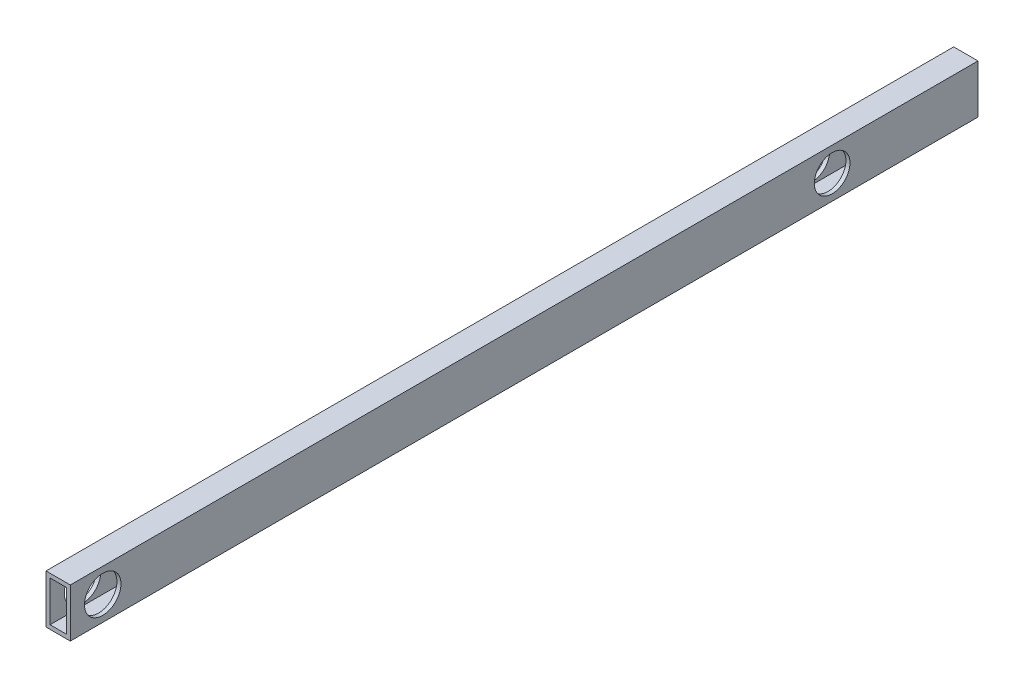
ISO-10303-21;
HEADER;
FILE_DESCRIPTION(('STEP AP214'),'2;1');
FILE_NAME('part.step','',(''),(''),'','','');
FILE_SCHEMA(('AUTOMOTIVE_DESIGN { 1 0 10303 214 1 1 1 1 }'));
ENDSEC;
DATA;
#1=APPLICATION_CONTEXT('core data for automotive mechanical design processes');
#2=APPLICATION_PROTOCOL_DEFINITION('international standard','automotive_design',2000,#1);
#3=PRODUCT_CONTEXT('',#1,'mechanical');
#4=PRODUCT('Part','Part','',(#3));
#5=PRODUCT_RELATED_PRODUCT_CATEGORY('part','',(#4));
#6=PRODUCT_DEFINITION_FORMATION('','',#4);
#7=PRODUCT_DEFINITION_CONTEXT('part definition',#1,'design');
#8=PRODUCT_DEFINITION('design','',#6,#7);
#9=PRODUCT_DEFINITION_SHAPE('','',#8);
#10=(LENGTH_UNIT() NAMED_UNIT(*) SI_UNIT(.MILLI.,.METRE.));
#11=(NAMED_UNIT(*) PLANE_ANGLE_UNIT() SI_UNIT($,.RADIAN.));
#12=(NAMED_UNIT(*) SI_UNIT($,.STERADIAN.) SOLID_ANGLE_UNIT());
#13=UNCERTAINTY_MEASURE_WITH_UNIT(LENGTH_MEASURE(1.E-05),#10,'distance_accuracy_value','');
#14=(GEOMETRIC_REPRESENTATION_CONTEXT(3) GLOBAL_UNCERTAINTY_ASSIGNED_CONTEXT((#13)) GLOBAL_UNIT_ASSIGNED_CONTEXT((#10,
#11,#12)) REPRESENTATION_CONTEXT('',''));
#15=CARTESIAN_POINT('',(0.,0.,0.));
#16=DIRECTION('',(0.,0.,1.));
#17=DIRECTION('',(1.,0.,0.));
#18=AXIS2_PLACEMENT_3D('',#15,#16,#17);
#19=CARTESIAN_POINT('',(0.,0.,711.2));
#20=DIRECTION('',(0.,0.,1.));
#21=DIRECTION('',(1.,0.,0.));
#22=AXIS2_PLACEMENT_3D('',#19,#20,#21);
#23=PLANE('',#22);
#24=DIRECTION('',(0.,-1.,0.));
#25=VECTOR('',#24,1.);
#26=CARTESIAN_POINT('',(0.,0.,711.2));
#27=LINE('',#26,#25);
#28=CARTESIAN_POINT('',(0.,38.1,711.2));
#29=VERTEX_POINT('',#28);
#30=CARTESIAN_POINT('',(0.,0.,711.2));
#31=VERTEX_POINT('',#30);
#32=EDGE_CURVE('E161',#29,#31,#27,.T.);
#33=ORIENTED_EDGE('',*,*,#32,.T.);
#34=DIRECTION('',(1.,0.,0.));
#35=VECTOR('',#34,1.);
#36=CARTESIAN_POINT('',(0.,0.,711.2));
#37=LINE('',#36,#35);
#38=CARTESIAN_POINT('',(19.05,0.,711.2));
#39=VERTEX_POINT('',#38);
#40=EDGE_CURVE('E164',#31,#39,#37,.T.);
#41=ORIENTED_EDGE('',*,*,#40,.T.);
#42=DIRECTION('',(0.,1.,0.));
#43=VECTOR('',#42,1.);
#44=CARTESIAN_POINT('',(19.05,0.,711.2));
#45=LINE('',#44,#43);
#46=CARTESIAN_POINT('',(19.05,38.1,711.2));
#47=VERTEX_POINT('',#46);
#48=EDGE_CURVE('E167',#39,#47,#45,.T.);
#49=ORIENTED_EDGE('',*,*,#48,.T.);
#50=DIRECTION('',(-1.,0.,0.));
#51=VECTOR('',#50,1.);
#52=CARTESIAN_POINT('',(0.,38.1,711.2));
#53=LINE('',#52,#51);
#54=EDGE_CURVE('E169',#47,#29,#53,.T.);
#55=ORIENTED_EDGE('',*,*,#54,.T.);
#56=EDGE_LOOP('',(#33,#41,#49,#55));
#57=FACE_BOUND('',#56,.T.);
#58=DIRECTION('',(1.,0.,0.));
#59=VECTOR('',#58,1.);
#60=CARTESIAN_POINT('',(0.,3.175,711.2));
#61=LINE('',#60,#59);
#62=CARTESIAN_POINT('',(3.175,3.175,711.2));
#63=VERTEX_POINT('',#62);
#64=CARTESIAN_POINT('',(15.875,3.175,711.2));
#65=VERTEX_POINT('',#64);
#66=EDGE_CURVE('E131',#63,#65,#61,.T.);
#67=ORIENTED_EDGE('',*,*,#66,.F.);
#68=DIRECTION('',(0.,-1.,0.));
#69=VECTOR('',#68,1.);
#70=CARTESIAN_POINT('',(3.175,0.,711.2));
#71=LINE('',#70,#69);
#72=CARTESIAN_POINT('',(3.175,34.925,711.2));
#73=VERTEX_POINT('',#72);
#74=EDGE_CURVE('E123',#73,#63,#71,.T.);
#75=ORIENTED_EDGE('',*,*,#74,.F.);
#76=DIRECTION('',(-1.,0.,0.));
#77=VECTOR('',#76,1.);
#78=CARTESIAN_POINT('',(0.,34.925,711.2));
#79=LINE('',#78,#77);
#80=CARTESIAN_POINT('',(15.875,34.925,711.2));
#81=VERTEX_POINT('',#80);
#82=EDGE_CURVE('E145',#81,#73,#79,.T.);
#83=ORIENTED_EDGE('',*,*,#82,.F.);
#84=DIRECTION('',(0.,1.,0.));
#85=VECTOR('',#84,1.);
#86=CARTESIAN_POINT('',(15.875,0.,711.2));
#87=LINE('',#86,#85);
#88=EDGE_CURVE('E143',#65,#81,#87,.T.);
#89=ORIENTED_EDGE('',*,*,#88,.F.);
#90=EDGE_LOOP('',(#67,#75,#83,#89));
#91=FACE_BOUND('',#90,.T.);
#92=ADVANCED_FACE('F56',(#57,#91),#23,.T.);
#93=CARTESIAN_POINT('',(0.,0.,0.));
#94=DIRECTION('',(0.,0.,1.));
#95=DIRECTION('',(1.,0.,0.));
#96=AXIS2_PLACEMENT_3D('',#93,#94,#95);
#97=PLANE('',#96);
#98=DIRECTION('',(0.,-1.,0.));
#99=VECTOR('',#98,1.);
#100=CARTESIAN_POINT('',(0.,0.,0.));
#101=LINE('',#100,#99);
#102=CARTESIAN_POINT('',(0.,38.1,0.));
#103=VERTEX_POINT('',#102);
#104=CARTESIAN_POINT('',(0.,0.,0.));
#105=VERTEX_POINT('',#104);
#106=EDGE_CURVE('E139',#103,#105,#101,.T.);
#107=ORIENTED_EDGE('',*,*,#106,.F.);
#108=DIRECTION('',(-1.,0.,0.));
#109=VECTOR('',#108,1.);
#110=CARTESIAN_POINT('',(0.,38.1,0.));
#111=LINE('',#110,#109);
#112=CARTESIAN_POINT('',(19.05,38.1,0.));
#113=VERTEX_POINT('',#112);
#114=EDGE_CURVE('E165',#113,#103,#111,.T.);
#115=ORIENTED_EDGE('',*,*,#114,.F.);
#116=DIRECTION('',(0.,1.,0.));
#117=VECTOR('',#116,1.);
#118=CARTESIAN_POINT('',(19.05,0.,0.));
#119=LINE('',#118,#117);
#120=CARTESIAN_POINT('',(19.05,0.,0.));
#121=VERTEX_POINT('',#120);
#122=EDGE_CURVE('E176',#121,#113,#119,.T.);
#123=ORIENTED_EDGE('',*,*,#122,.F.);
#124=DIRECTION('',(1.,0.,0.));
#125=VECTOR('',#124,1.);
#126=CARTESIAN_POINT('',(0.,0.,0.));
#127=LINE('',#126,#125);
#128=EDGE_CURVE('E174',#105,#121,#127,.T.);
#129=ORIENTED_EDGE('',*,*,#128,.F.);
#130=EDGE_LOOP('',(#107,#115,#123,#129));
#131=FACE_BOUND('',#130,.T.);
#132=DIRECTION('',(0.,-1.,0.));
#133=VECTOR('',#132,1.);
#134=CARTESIAN_POINT('',(3.175,0.,0.));
#135=LINE('',#134,#133);
#136=CARTESIAN_POINT('',(3.175,34.925,0.));
#137=VERTEX_POINT('',#136);
#138=CARTESIAN_POINT('',(3.175,3.175,0.));
#139=VERTEX_POINT('',#138);
#140=EDGE_CURVE('E81',#137,#139,#135,.T.);
#141=ORIENTED_EDGE('',*,*,#140,.T.);
#142=DIRECTION('',(1.,0.,0.));
#143=VECTOR('',#142,1.);
#144=CARTESIAN_POINT('',(0.,3.175,0.));
#145=LINE('',#144,#143);
#146=CARTESIAN_POINT('',(15.875,3.175,0.));
#147=VERTEX_POINT('',#146);
#148=EDGE_CURVE('E138',#139,#147,#145,.T.);
#149=ORIENTED_EDGE('',*,*,#148,.T.);
#150=DIRECTION('',(0.,1.,0.));
#151=VECTOR('',#150,1.);
#152=CARTESIAN_POINT('',(15.875,0.,0.));
#153=LINE('',#152,#151);
#154=CARTESIAN_POINT('',(15.875,34.925,0.));
#155=VERTEX_POINT('',#154);
#156=EDGE_CURVE('E153',#147,#155,#153,.T.);
#157=ORIENTED_EDGE('',*,*,#156,.T.);
#158=DIRECTION('',(-1.,0.,0.));
#159=VECTOR('',#158,1.);
#160=CARTESIAN_POINT('',(0.,34.925,0.));
#161=LINE('',#160,#159);
#162=EDGE_CURVE('E132',#155,#137,#161,.T.);
#163=ORIENTED_EDGE('',*,*,#162,.T.);
#164=EDGE_LOOP('',(#141,#149,#157,#163));
#165=FACE_BOUND('',#164,.T.);
#166=ADVANCED_FACE('F223',(#131,#165),#97,.F.);
#167=CARTESIAN_POINT('',(0.,0.,711.2));
#168=DIRECTION('',(1.,0.,0.));
#169=DIRECTION('',(0.,0.,-1.));
#170=AXIS2_PLACEMENT_3D('',#167,#168,#169);
#171=PLANE('',#170);
#172=CARTESIAN_POINT('',(0.,19.05,685.8));
#173=DIRECTION('',(1.,0.,0.));
#174=DIRECTION('',(0.,0.,-1.));
#175=AXIS2_PLACEMENT_3D('',#172,#173,#174);
#176=CIRCLE('',#175,14.2875);
#177=CARTESIAN_POINT('',(0.,19.05,671.5125));
#178=VERTEX_POINT('',#177);
#179=EDGE_CURVE('E205',#178,#178,#176,.T.);
#180=ORIENTED_EDGE('',*,*,#179,.T.);
#181=EDGE_LOOP('',(#180));
#182=FACE_BOUND('',#181,.T.);
#183=CARTESIAN_POINT('',(0.,19.05,114.3));
#184=DIRECTION('',(1.,0.,0.));
#185=DIRECTION('',(0.,0.,-1.));
#186=AXIS2_PLACEMENT_3D('',#183,#184,#185);
#187=CIRCLE('',#186,13.97);
#188=CARTESIAN_POINT('',(0.,19.05,100.33));
#189=VERTEX_POINT('',#188);
#190=EDGE_CURVE('E187',#189,#189,#187,.T.);
#191=ORIENTED_EDGE('',*,*,#190,.T.);
#192=EDGE_LOOP('',(#191));
#193=FACE_BOUND('',#192,.T.);
#194=ORIENTED_EDGE('',*,*,#106,.T.);
#195=DIRECTION('',(0.,0.,-1.));
#196=VECTOR('',#195,1.);
#197=CARTESIAN_POINT('',(0.,0.,711.2));
#198=LINE('',#197,#196);
#199=EDGE_CURVE('E12',#31,#105,#198,.T.);
#200=ORIENTED_EDGE('',*,*,#199,.F.);
#201=ORIENTED_EDGE('',*,*,#32,.F.);
#202=DIRECTION('',(0.,0.,-1.));
#203=VECTOR('',#202,1.);
#204=CARTESIAN_POINT('',(0.,38.1,711.2));
#205=LINE('',#204,#203);
#206=EDGE_CURVE('E171',#29,#103,#205,.T.);
#207=ORIENTED_EDGE('',*,*,#206,.T.);
#208=EDGE_LOOP('',(#194,#200,#201,#207));
#209=FACE_BOUND('',#208,.T.);
#210=ADVANCED_FACE('F58',(#182,#193,#209),#171,.F.);
#211=CARTESIAN_POINT('',(0.,0.,711.2));
#212=DIRECTION('',(0.,1.,0.));
#213=DIRECTION('',(0.,0.,1.));
#214=AXIS2_PLACEMENT_3D('',#211,#212,#213);
#215=PLANE('',#214);
#216=ORIENTED_EDGE('',*,*,#128,.T.);
#217=DIRECTION('',(0.,0.,-1.));
#218=VECTOR('',#217,1.);
#219=CARTESIAN_POINT('',(19.05,0.,711.2));
#220=LINE('',#219,#218);
#221=EDGE_CURVE('E65',#39,#121,#220,.T.);
#222=ORIENTED_EDGE('',*,*,#221,.F.);
#223=ORIENTED_EDGE('',*,*,#40,.F.);
#224=ORIENTED_EDGE('',*,*,#199,.T.);
#225=EDGE_LOOP('',(#216,#222,#223,#224));
#226=FACE_BOUND('',#225,.T.);
#227=ADVANCED_FACE('F249',(#226),#215,.F.);
#228=CARTESIAN_POINT('',(19.05,0.,711.2));
#229=DIRECTION('',(-1.,0.,0.));
#230=DIRECTION('',(0.,0.,1.));
#231=AXIS2_PLACEMENT_3D('',#228,#229,#230);
#232=PLANE('',#231);
#233=CARTESIAN_POINT('',(19.05,19.05,685.8));
#234=DIRECTION('',(1.,0.,0.));
#235=DIRECTION('',(0.,0.,-1.));
#236=AXIS2_PLACEMENT_3D('',#233,#234,#235);
#237=CIRCLE('',#236,14.2875);
#238=CARTESIAN_POINT('',(19.05,19.05,671.5125));
#239=VERTEX_POINT('',#238);
#240=EDGE_CURVE('E202',#239,#239,#237,.T.);
#241=ORIENTED_EDGE('',*,*,#240,.F.);
#242=EDGE_LOOP('',(#241));
#243=FACE_BOUND('',#242,.T.);
#244=CARTESIAN_POINT('',(19.05,19.05,114.3));
#245=DIRECTION('',(1.,0.,0.));
#246=DIRECTION('',(0.,0.,-1.));
#247=AXIS2_PLACEMENT_3D('',#244,#245,#246);
#248=CIRCLE('',#247,13.97);
#249=CARTESIAN_POINT('',(19.05,19.05,100.33));
#250=VERTEX_POINT('',#249);
#251=EDGE_CURVE('E192',#250,#250,#248,.T.);
#252=ORIENTED_EDGE('',*,*,#251,.F.);
#253=EDGE_LOOP('',(#252));
#254=FACE_BOUND('',#253,.T.);
#255=ORIENTED_EDGE('',*,*,#122,.T.);
#256=DIRECTION('',(0.,0.,-1.));
#257=VECTOR('',#256,1.);
#258=CARTESIAN_POINT('',(19.05,38.1,711.2));
#259=LINE('',#258,#257);
#260=EDGE_CURVE('E181',#47,#113,#259,.T.);
#261=ORIENTED_EDGE('',*,*,#260,.F.);
#262=ORIENTED_EDGE('',*,*,#48,.F.);
#263=ORIENTED_EDGE('',*,*,#221,.T.);
#264=EDGE_LOOP('',(#255,#261,#262,#263));
#265=FACE_BOUND('',#264,.T.);
#266=ADVANCED_FACE('F246',(#243,#254,#265),#232,.F.);
#267=CARTESIAN_POINT('',(0.,38.1,711.2));
#268=DIRECTION('',(0.,-1.,0.));
#269=DIRECTION('',(0.,0.,-1.));
#270=AXIS2_PLACEMENT_3D('',#267,#268,#269);
#271=PLANE('',#270);
#272=ORIENTED_EDGE('',*,*,#114,.T.);
#273=ORIENTED_EDGE('',*,*,#206,.F.);
#274=ORIENTED_EDGE('',*,*,#54,.F.);
#275=ORIENTED_EDGE('',*,*,#260,.T.);
#276=EDGE_LOOP('',(#272,#273,#274,#275));
#277=FACE_BOUND('',#276,.T.);
#278=ADVANCED_FACE('F243',(#277),#271,.F.);
#279=CARTESIAN_POINT('',(3.175,0.,711.2));
#280=DIRECTION('',(1.,0.,0.));
#281=DIRECTION('',(0.,0.,-1.));
#282=AXIS2_PLACEMENT_3D('',#279,#280,#281);
#283=PLANE('',#282);
#284=CARTESIAN_POINT('',(3.175,19.05,685.8));
#285=DIRECTION('',(1.,0.,0.));
#286=DIRECTION('',(0.,0.,-1.));
#287=AXIS2_PLACEMENT_3D('',#284,#285,#286);
#288=CIRCLE('',#287,14.2875);
#289=CARTESIAN_POINT('',(3.175,19.05,671.5125));
#290=VERTEX_POINT('',#289);
#291=EDGE_CURVE('E197',#290,#290,#288,.T.);
#292=ORIENTED_EDGE('',*,*,#291,.F.);
#293=EDGE_LOOP('',(#292));
#294=FACE_BOUND('',#293,.T.);
#295=CARTESIAN_POINT('',(3.175,19.05,114.3));
#296=DIRECTION('',(1.,0.,0.));
#297=DIRECTION('',(0.,0.,-1.));
#298=AXIS2_PLACEMENT_3D('',#295,#296,#297);
#299=CIRCLE('',#298,13.97);
#300=CARTESIAN_POINT('',(3.175,19.05,100.33));
#301=VERTEX_POINT('',#300);
#302=EDGE_CURVE('E151',#301,#301,#299,.T.);
#303=ORIENTED_EDGE('',*,*,#302,.F.);
#304=EDGE_LOOP('',(#303));
#305=FACE_BOUND('',#304,.T.);
#306=ORIENTED_EDGE('',*,*,#140,.F.);
#307=DIRECTION('',(0.,0.,-1.));
#308=VECTOR('',#307,1.);
#309=CARTESIAN_POINT('',(3.175,34.925,711.2));
#310=LINE('',#309,#308);
#311=EDGE_CURVE('E127',#73,#137,#310,.T.);
#312=ORIENTED_EDGE('',*,*,#311,.F.);
#313=ORIENTED_EDGE('',*,*,#74,.T.);
#314=DIRECTION('',(0.,0.,-1.));
#315=VECTOR('',#314,1.);
#316=CARTESIAN_POINT('',(3.175,3.175,711.2));
#317=LINE('',#316,#315);
#318=EDGE_CURVE('E126',#63,#139,#317,.T.);
#319=ORIENTED_EDGE('',*,*,#318,.T.);
#320=EDGE_LOOP('',(#306,#312,#313,#319));
#321=FACE_BOUND('',#320,.T.);
#322=ADVANCED_FACE('F125',(#294,#305,#321),#283,.T.);
#323=CARTESIAN_POINT('',(0.,3.175,711.2));
#324=DIRECTION('',(0.,1.,0.));
#325=DIRECTION('',(0.,0.,1.));
#326=AXIS2_PLACEMENT_3D('',#323,#324,#325);
#327=PLANE('',#326);
#328=ORIENTED_EDGE('',*,*,#148,.F.);
#329=ORIENTED_EDGE('',*,*,#318,.F.);
#330=ORIENTED_EDGE('',*,*,#66,.T.);
#331=DIRECTION('',(0.,0.,-1.));
#332=VECTOR('',#331,1.);
#333=CARTESIAN_POINT('',(15.875,3.175,711.2));
#334=LINE('',#333,#332);
#335=EDGE_CURVE('E140',#65,#147,#334,.T.);
#336=ORIENTED_EDGE('',*,*,#335,.T.);
#337=EDGE_LOOP('',(#328,#329,#330,#336));
#338=FACE_BOUND('',#337,.T.);
#339=ADVANCED_FACE('F135',(#338),#327,.T.);
#340=CARTESIAN_POINT('',(15.875,0.,711.2));
#341=DIRECTION('',(-1.,0.,0.));
#342=DIRECTION('',(0.,0.,1.));
#343=AXIS2_PLACEMENT_3D('',#340,#341,#342);
#344=PLANE('',#343);
#345=CARTESIAN_POINT('',(15.875,19.05,685.8));
#346=DIRECTION('',(-1.,0.,0.));
#347=DIRECTION('',(0.,0.,1.));
#348=AXIS2_PLACEMENT_3D('',#345,#346,#347);
#349=CIRCLE('',#348,14.2875);
#350=CARTESIAN_POINT('',(15.875,19.05,671.5125));
#351=VERTEX_POINT('',#350);
#352=EDGE_CURVE('E60',#351,#351,#349,.T.);
#353=ORIENTED_EDGE('',*,*,#352,.F.);
#354=EDGE_LOOP('',(#353));
#355=FACE_BOUND('',#354,.T.);
#356=CARTESIAN_POINT('',(15.875,19.05,114.3));
#357=DIRECTION('',(-1.,0.,0.));
#358=DIRECTION('',(0.,0.,1.));
#359=AXIS2_PLACEMENT_3D('',#356,#357,#358);
#360=CIRCLE('',#359,13.97);
#361=CARTESIAN_POINT('',(15.875,19.05,100.33));
#362=VERTEX_POINT('',#361);
#363=EDGE_CURVE('E185',#362,#362,#360,.T.);
#364=ORIENTED_EDGE('',*,*,#363,.F.);
#365=EDGE_LOOP('',(#364));
#366=FACE_BOUND('',#365,.T.);
#367=ORIENTED_EDGE('',*,*,#156,.F.);
#368=ORIENTED_EDGE('',*,*,#335,.F.);
#369=ORIENTED_EDGE('',*,*,#88,.T.);
#370=DIRECTION('',(0.,0.,-1.));
#371=VECTOR('',#370,1.);
#372=CARTESIAN_POINT('',(15.875,34.925,711.2));
#373=LINE('',#372,#371);
#374=EDGE_CURVE('E73',#81,#155,#373,.T.);
#375=ORIENTED_EDGE('',*,*,#374,.T.);
#376=EDGE_LOOP('',(#367,#368,#369,#375));
#377=FACE_BOUND('',#376,.T.);
#378=ADVANCED_FACE('F215',(#355,#366,#377),#344,.T.);
#379=CARTESIAN_POINT('',(0.,34.925,711.2));
#380=DIRECTION('',(0.,-1.,0.));
#381=DIRECTION('',(0.,0.,-1.));
#382=AXIS2_PLACEMENT_3D('',#379,#380,#381);
#383=PLANE('',#382);
#384=ORIENTED_EDGE('',*,*,#162,.F.);
#385=ORIENTED_EDGE('',*,*,#374,.F.);
#386=ORIENTED_EDGE('',*,*,#82,.T.);
#387=ORIENTED_EDGE('',*,*,#311,.T.);
#388=EDGE_LOOP('',(#384,#385,#386,#387));
#389=FACE_BOUND('',#388,.T.);
#390=ADVANCED_FACE('F218',(#389),#383,.T.);
#391=CARTESIAN_POINT('',(0.,19.05,114.3));
#392=DIRECTION('',(1.,0.,0.));
#393=DIRECTION('',(0.,0.,-1.));
#394=AXIS2_PLACEMENT_3D('',#391,#392,#393);
#395=CYLINDRICAL_SURFACE('',#394,13.97);
#396=CARTESIAN_POINT('',(15.875,19.05,100.33));
#397=CARTESIAN_POINT('',(15.9080729166667,19.05,100.33));
#398=CARTESIAN_POINT('',(15.9411458333333,19.05,100.33));
#399=CARTESIAN_POINT('',(16.0072916666667,19.05,100.33));
#400=CARTESIAN_POINT('',(16.0403645833333,19.05,100.33));
#401=CARTESIAN_POINT('',(16.1065104166667,19.05,100.33));
#402=CARTESIAN_POINT('',(16.1395833333333,19.05,100.33));
#403=CARTESIAN_POINT('',(16.2057291666667,19.05,100.33));
#404=CARTESIAN_POINT('',(16.2388020833333,19.05,100.33));
#405=CARTESIAN_POINT('',(16.3049479166667,19.05,100.33));
#406=CARTESIAN_POINT('',(16.3380208333333,19.05,100.33));
#407=CARTESIAN_POINT('',(16.4041666666667,19.05,100.33));
#408=CARTESIAN_POINT('',(16.4372395833333,19.05,100.33));
#409=CARTESIAN_POINT('',(16.5033854166667,19.05,100.33));
#410=CARTESIAN_POINT('',(16.5364583333333,19.05,100.33));
#411=CARTESIAN_POINT('',(16.6026041666667,19.05,100.33));
#412=CARTESIAN_POINT('',(16.6356770833333,19.05,100.33));
#413=CARTESIAN_POINT('',(16.7018229166667,19.05,100.33));
#414=CARTESIAN_POINT('',(16.7348958333333,19.05,100.33));
#415=CARTESIAN_POINT('',(16.8010416666667,19.05,100.33));
#416=CARTESIAN_POINT('',(16.8341145833333,19.05,100.33));
#417=CARTESIAN_POINT('',(16.9002604166667,19.05,100.33));
#418=CARTESIAN_POINT('',(16.9333333333333,19.05,100.33));
#419=CARTESIAN_POINT('',(16.9994791666667,19.05,100.33));
#420=CARTESIAN_POINT('',(17.0325520833333,19.05,100.33));
#421=CARTESIAN_POINT('',(17.0986979166667,19.05,100.33));
#422=CARTESIAN_POINT('',(17.1317708333333,19.05,100.33));
#423=CARTESIAN_POINT('',(17.1979166666667,19.05,100.33));
#424=CARTESIAN_POINT('',(17.2309895833333,19.05,100.33));
#425=CARTESIAN_POINT('',(17.2971354166667,19.05,100.33));
#426=CARTESIAN_POINT('',(17.3302083333333,19.05,100.33));
#427=CARTESIAN_POINT('',(17.3963541666667,19.05,100.33));
#428=CARTESIAN_POINT('',(17.4294270833333,19.05,100.33));
#429=CARTESIAN_POINT('',(17.4955729166667,19.05,100.33));
#430=CARTESIAN_POINT('',(17.5286458333333,19.05,100.33));
#431=CARTESIAN_POINT('',(17.5947916666667,19.05,100.33));
#432=CARTESIAN_POINT('',(17.6278645833333,19.05,100.33));
#433=CARTESIAN_POINT('',(17.6940104166667,19.05,100.33));
#434=CARTESIAN_POINT('',(17.7270833333333,19.05,100.33));
#435=CARTESIAN_POINT('',(17.7932291666667,19.05,100.33));
#436=CARTESIAN_POINT('',(17.8263020833333,19.05,100.33));
#437=CARTESIAN_POINT('',(17.8924479166667,19.05,100.33));
#438=CARTESIAN_POINT('',(17.9255208333333,19.05,100.33));
#439=CARTESIAN_POINT('',(17.9916666666667,19.05,100.33));
#440=CARTESIAN_POINT('',(18.0247395833333,19.05,100.33));
#441=CARTESIAN_POINT('',(18.0908854166667,19.05,100.33));
#442=CARTESIAN_POINT('',(18.1239583333333,19.05,100.33));
#443=CARTESIAN_POINT('',(18.1901041666667,19.05,100.33));
#444=CARTESIAN_POINT('',(18.2231770833333,19.05,100.33));
#445=CARTESIAN_POINT('',(18.2893229166667,19.05,100.33));
#446=CARTESIAN_POINT('',(18.3223958333333,19.05,100.33));
#447=CARTESIAN_POINT('',(18.3885416666667,19.05,100.33));
#448=CARTESIAN_POINT('',(18.4216145833333,19.05,100.33));
#449=CARTESIAN_POINT('',(18.4877604166667,19.05,100.33));
#450=CARTESIAN_POINT('',(18.5208333333333,19.05,100.33));
#451=CARTESIAN_POINT('',(18.5869791666667,19.05,100.33));
#452=CARTESIAN_POINT('',(18.6200520833333,19.05,100.33));
#453=CARTESIAN_POINT('',(18.6861979166667,19.05,100.33));
#454=CARTESIAN_POINT('',(18.7192708333333,19.05,100.33));
#455=CARTESIAN_POINT('',(18.7854166666667,19.05,100.33));
#456=CARTESIAN_POINT('',(18.8184895833333,19.05,100.33));
#457=CARTESIAN_POINT('',(18.8846354166667,19.05,100.33));
#458=CARTESIAN_POINT('',(18.9177083333333,19.05,100.33));
#459=CARTESIAN_POINT('',(18.9838541666667,19.05,100.33));
#460=CARTESIAN_POINT('',(19.0169270833333,19.05,100.33));
#461=CARTESIAN_POINT('',(19.05,19.05,100.33));
#462=B_SPLINE_CURVE_WITH_KNOTS('',3,(#396,#397,#398,#399,#400,#401,#402,#403,#404,#405,#406,
#407,#408,#409,#410,#411,#412,#413,#414,#415,#416,#417,#418,#419,#420,#421,#422,#423,#424,#425,
#426,#427,#428,#429,#430,#431,#432,#433,#434,#435,#436,#437,#438,#439,#440,#441,#442,#443,#444,
#445,#446,#447,#448,#449,#450,#451,#452,#453,#454,#455,#456,#457,#458,#459,#460,#461),
.UNSPECIFIED.,.F.,.F.,(4,2,2,2,2,2,2,2,2,2,2,2,2,2,2,2,2,2,2,2,2,2,2,2,2,2,2,2,2,2,2,2,4),(0.,
0.0992187500000012,0.198437499999999,0.29765625,0.396874999999998,0.496093749999999,0.5953125,
0.694531249999998,0.793749999999999,0.892968750000001,0.992187499999998,1.09140625,1.190625,
1.28984375,1.3890625,1.48828125,1.5875,1.68671875,1.7859375,1.88515625,1.984375,2.08359375,
2.1828125,2.28203125,2.38125,2.48046875,2.5796875,2.67890625,2.778125,2.87734375,2.9765625,
3.07578125,3.175),.UNSPECIFIED.);
#463=EDGE_CURVE('BSEAM225',#362,#250,#462,.T.);
#464=ORIENTED_EDGE('',*,*,#363,.T.);
#465=ORIENTED_EDGE('',*,*,#251,.T.);
#466=ORIENTED_EDGE('',*,*,#463,.T.);
#467=ORIENTED_EDGE('',*,*,#463,.F.);
#468=EDGE_LOOP('',(#464,#466,#465,#467));
#469=FACE_BOUND('',#468,.T.);
#470=ADVANCED_FACE('F225',(#469),#395,.F.);
#471=CARTESIAN_POINT('',(3.175,19.05,100.33));
#472=CARTESIAN_POINT('',(3.14192708333333,19.05,100.33));
#473=CARTESIAN_POINT('',(3.10885416666667,19.05,100.33));
#474=CARTESIAN_POINT('',(3.04270833333333,19.05,100.33));
#475=CARTESIAN_POINT('',(3.00963541666667,19.05,100.33));
#476=CARTESIAN_POINT('',(2.94348958333333,19.05,100.33));
#477=CARTESIAN_POINT('',(2.91041666666667,19.05,100.33));
#478=CARTESIAN_POINT('',(2.84427083333333,19.05,100.33));
#479=CARTESIAN_POINT('',(2.81119791666667,19.05,100.33));
#480=CARTESIAN_POINT('',(2.74505208333333,19.05,100.33));
#481=CARTESIAN_POINT('',(2.71197916666667,19.05,100.33));
#482=CARTESIAN_POINT('',(2.64583333333333,19.05,100.33));
#483=CARTESIAN_POINT('',(2.61276041666667,19.05,100.33));
#484=CARTESIAN_POINT('',(2.54661458333333,19.05,100.33));
#485=CARTESIAN_POINT('',(2.51354166666667,19.05,100.33));
#486=CARTESIAN_POINT('',(2.44739583333333,19.05,100.33));
#487=CARTESIAN_POINT('',(2.41432291666667,19.05,100.33));
#488=CARTESIAN_POINT('',(2.34817708333333,19.05,100.33));
#489=CARTESIAN_POINT('',(2.31510416666667,19.05,100.33));
#490=CARTESIAN_POINT('',(2.24895833333333,19.05,100.33));
#491=CARTESIAN_POINT('',(2.21588541666667,19.05,100.33));
#492=CARTESIAN_POINT('',(2.14973958333333,19.05,100.33));
#493=CARTESIAN_POINT('',(2.11666666666667,19.05,100.33));
#494=CARTESIAN_POINT('',(2.05052083333333,19.05,100.33));
#495=CARTESIAN_POINT('',(2.01744791666667,19.05,100.33));
#496=CARTESIAN_POINT('',(1.95130208333333,19.05,100.33));
#497=CARTESIAN_POINT('',(1.91822916666667,19.05,100.33));
#498=CARTESIAN_POINT('',(1.85208333333333,19.05,100.33));
#499=CARTESIAN_POINT('',(1.81901041666667,19.05,100.33));
#500=CARTESIAN_POINT('',(1.75286458333333,19.05,100.33));
#501=CARTESIAN_POINT('',(1.71979166666667,19.05,100.33));
#502=CARTESIAN_POINT('',(1.65364583333333,19.05,100.33));
#503=CARTESIAN_POINT('',(1.62057291666667,19.05,100.33));
#504=CARTESIAN_POINT('',(1.55442708333333,19.05,100.33));
#505=CARTESIAN_POINT('',(1.52135416666667,19.05,100.33));
#506=CARTESIAN_POINT('',(1.45520833333333,19.05,100.33));
#507=CARTESIAN_POINT('',(1.42213541666667,19.05,100.33));
#508=CARTESIAN_POINT('',(1.35598958333333,19.05,100.33));
#509=CARTESIAN_POINT('',(1.32291666666667,19.05,100.33));
#510=CARTESIAN_POINT('',(1.25677083333333,19.05,100.33));
#511=CARTESIAN_POINT('',(1.22369791666667,19.05,100.33));
#512=CARTESIAN_POINT('',(1.15755208333333,19.05,100.33));
#513=CARTESIAN_POINT('',(1.12447916666667,19.05,100.33));
#514=CARTESIAN_POINT('',(1.05833333333333,19.05,100.33));
#515=CARTESIAN_POINT('',(1.02526041666667,19.05,100.33));
#516=CARTESIAN_POINT('',(0.959114583333333,19.05,100.33));
#517=CARTESIAN_POINT('',(0.926041666666667,19.05,100.33));
#518=CARTESIAN_POINT('',(0.859895833333333,19.05,100.33));
#519=CARTESIAN_POINT('',(0.826822916666667,19.05,100.33));
#520=CARTESIAN_POINT('',(0.760677083333333,19.05,100.33));
#521=CARTESIAN_POINT('',(0.727604166666666,19.05,100.33));
#522=CARTESIAN_POINT('',(0.661458333333333,19.05,100.33));
#523=CARTESIAN_POINT('',(0.628385416666666,19.05,100.33));
#524=CARTESIAN_POINT('',(0.562239583333333,19.05,100.33));
#525=CARTESIAN_POINT('',(0.529166666666666,19.05,100.33));
#526=CARTESIAN_POINT('',(0.463020833333333,19.05,100.33));
#527=CARTESIAN_POINT('',(0.429947916666667,19.05,100.33));
#528=CARTESIAN_POINT('',(0.363802083333333,19.05,100.33));
#529=CARTESIAN_POINT('',(0.330729166666667,19.05,100.33));
#530=CARTESIAN_POINT('',(0.264583333333333,19.05,100.33));
#531=CARTESIAN_POINT('',(0.231510416666667,19.05,100.33));
#532=CARTESIAN_POINT('',(0.165364583333333,19.05,100.33));
#533=CARTESIAN_POINT('',(0.132291666666667,19.05,100.33));
#534=CARTESIAN_POINT('',(0.0661458333333333,19.05,100.33));
#535=CARTESIAN_POINT('',(0.0330729166666666,19.05,100.33));
#536=CARTESIAN_POINT('',(0.,19.05,100.33));
#537=B_SPLINE_CURVE_WITH_KNOTS('',3,(#471,#472,#473,#474,#475,#476,#477,#478,#479,#480,#481,
#482,#483,#484,#485,#486,#487,#488,#489,#490,#491,#492,#493,#494,#495,#496,#497,#498,#499,#500,
#501,#502,#503,#504,#505,#506,#507,#508,#509,#510,#511,#512,#513,#514,#515,#516,#517,#518,#519,
#520,#521,#522,#523,#524,#525,#526,#527,#528,#529,#530,#531,#532,#533,#534,#535,#536),
.UNSPECIFIED.,.F.,.F.,(4,2,2,2,2,2,2,2,2,2,2,2,2,2,2,2,2,2,2,2,2,2,2,2,2,2,2,2,2,2,2,2,4),(0.,
0.0992187499999999,0.1984375,0.29765625,0.396875,0.49609375,0.5953125,0.69453125,0.79375,
0.89296875,0.9921875,1.09140625,1.190625,1.28984375,1.3890625,1.48828125,1.5875,1.68671875,
1.7859375,1.88515625,1.984375,2.08359375,2.1828125,2.28203125,2.38125,2.48046875,2.5796875,
2.67890625,2.778125,2.87734375,2.9765625,3.07578125,3.175),.UNSPECIFIED.);
#538=EDGE_CURVE('BSEAM230',#301,#189,#537,.T.);
#539=ORIENTED_EDGE('',*,*,#302,.T.);
#540=ORIENTED_EDGE('',*,*,#190,.F.);
#541=ORIENTED_EDGE('',*,*,#538,.T.);
#542=ORIENTED_EDGE('',*,*,#538,.F.);
#543=EDGE_LOOP('',(#539,#541,#540,#542));
#544=FACE_BOUND('',#543,.T.);
#545=ADVANCED_FACE('F230',(#544),#395,.F.);
#546=CARTESIAN_POINT('',(0.,19.05,685.8));
#547=DIRECTION('',(1.,0.,0.));
#548=DIRECTION('',(0.,0.,-1.));
#549=AXIS2_PLACEMENT_3D('',#546,#547,#548);
#550=CYLINDRICAL_SURFACE('',#549,14.2875);
#551=CARTESIAN_POINT('',(15.875,19.05,671.5125));
#552=CARTESIAN_POINT('',(15.9080729166667,19.05,671.5125));
#553=CARTESIAN_POINT('',(15.9411458333333,19.05,671.5125));
#554=CARTESIAN_POINT('',(16.0072916666667,19.05,671.5125));
#555=CARTESIAN_POINT('',(16.0403645833333,19.05,671.5125));
#556=CARTESIAN_POINT('',(16.1065104166667,19.05,671.5125));
#557=CARTESIAN_POINT('',(16.1395833333333,19.05,671.5125));
#558=CARTESIAN_POINT('',(16.2057291666667,19.05,671.5125));
#559=CARTESIAN_POINT('',(16.2388020833333,19.05,671.5125));
#560=CARTESIAN_POINT('',(16.3049479166667,19.05,671.5125));
#561=CARTESIAN_POINT('',(16.3380208333333,19.05,671.5125));
#562=CARTESIAN_POINT('',(16.4041666666667,19.05,671.5125));
#563=CARTESIAN_POINT('',(16.4372395833333,19.05,671.5125));
#564=CARTESIAN_POINT('',(16.5033854166667,19.05,671.5125));
#565=CARTESIAN_POINT('',(16.5364583333333,19.05,671.5125));
#566=CARTESIAN_POINT('',(16.6026041666667,19.05,671.5125));
#567=CARTESIAN_POINT('',(16.6356770833333,19.05,671.5125));
#568=CARTESIAN_POINT('',(16.7018229166667,19.05,671.5125));
#569=CARTESIAN_POINT('',(16.7348958333333,19.05,671.5125));
#570=CARTESIAN_POINT('',(16.8010416666667,19.05,671.5125));
#571=CARTESIAN_POINT('',(16.8341145833333,19.05,671.5125));
#572=CARTESIAN_POINT('',(16.9002604166667,19.05,671.5125));
#573=CARTESIAN_POINT('',(16.9333333333333,19.05,671.5125));
#574=CARTESIAN_POINT('',(16.9994791666667,19.05,671.5125));
#575=CARTESIAN_POINT('',(17.0325520833333,19.05,671.5125));
#576=CARTESIAN_POINT('',(17.0986979166667,19.05,671.5125));
#577=CARTESIAN_POINT('',(17.1317708333333,19.05,671.5125));
#578=CARTESIAN_POINT('',(17.1979166666667,19.05,671.5125));
#579=CARTESIAN_POINT('',(17.2309895833333,19.05,671.5125));
#580=CARTESIAN_POINT('',(17.2971354166667,19.05,671.5125));
#581=CARTESIAN_POINT('',(17.3302083333333,19.05,671.5125));
#582=CARTESIAN_POINT('',(17.3963541666667,19.05,671.5125));
#583=CARTESIAN_POINT('',(17.4294270833333,19.05,671.5125));
#584=CARTESIAN_POINT('',(17.4955729166667,19.05,671.5125));
#585=CARTESIAN_POINT('',(17.5286458333333,19.05,671.5125));
#586=CARTESIAN_POINT('',(17.5947916666667,19.05,671.5125));
#587=CARTESIAN_POINT('',(17.6278645833333,19.05,671.5125));
#588=CARTESIAN_POINT('',(17.6940104166667,19.05,671.5125));
#589=CARTESIAN_POINT('',(17.7270833333333,19.05,671.5125));
#590=CARTESIAN_POINT('',(17.7932291666667,19.05,671.5125));
#591=CARTESIAN_POINT('',(17.8263020833333,19.05,671.5125));
#592=CARTESIAN_POINT('',(17.8924479166667,19.05,671.5125));
#593=CARTESIAN_POINT('',(17.9255208333333,19.05,671.5125));
#594=CARTESIAN_POINT('',(17.9916666666667,19.05,671.5125));
#595=CARTESIAN_POINT('',(18.0247395833333,19.05,671.5125));
#596=CARTESIAN_POINT('',(18.0908854166667,19.05,671.5125));
#597=CARTESIAN_POINT('',(18.1239583333333,19.05,671.5125));
#598=CARTESIAN_POINT('',(18.1901041666667,19.05,671.5125));
#599=CARTESIAN_POINT('',(18.2231770833333,19.05,671.5125));
#600=CARTESIAN_POINT('',(18.2893229166667,19.05,671.5125));
#601=CARTESIAN_POINT('',(18.3223958333333,19.05,671.5125));
#602=CARTESIAN_POINT('',(18.3885416666667,19.05,671.5125));
#603=CARTESIAN_POINT('',(18.4216145833333,19.05,671.5125));
#604=CARTESIAN_POINT('',(18.4877604166667,19.05,671.5125));
#605=CARTESIAN_POINT('',(18.5208333333333,19.05,671.5125));
#606=CARTESIAN_POINT('',(18.5869791666667,19.05,671.5125));
#607=CARTESIAN_POINT('',(18.6200520833333,19.05,671.5125));
#608=CARTESIAN_POINT('',(18.6861979166667,19.05,671.5125));
#609=CARTESIAN_POINT('',(18.7192708333333,19.05,671.5125));
#610=CARTESIAN_POINT('',(18.7854166666667,19.05,671.5125));
#611=CARTESIAN_POINT('',(18.8184895833333,19.05,671.5125));
#612=CARTESIAN_POINT('',(18.8846354166667,19.05,671.5125));
#613=CARTESIAN_POINT('',(18.9177083333333,19.05,671.5125));
#614=CARTESIAN_POINT('',(18.9838541666667,19.05,671.5125));
#615=CARTESIAN_POINT('',(19.0169270833333,19.05,671.5125));
#616=CARTESIAN_POINT('',(19.05,19.05,671.5125));
#617=B_SPLINE_CURVE_WITH_KNOTS('',3,(#551,#552,#553,#554,#555,#556,#557,#558,#559,#560,#561,
#562,#563,#564,#565,#566,#567,#568,#569,#570,#571,#572,#573,#574,#575,#576,#577,#578,#579,#580,
#581,#582,#583,#584,#585,#586,#587,#588,#589,#590,#591,#592,#593,#594,#595,#596,#597,#598,#599,
#600,#601,#602,#603,#604,#605,#606,#607,#608,#609,#610,#611,#612,#613,#614,#615,#616),
.UNSPECIFIED.,.F.,.F.,(4,2,2,2,2,2,2,2,2,2,2,2,2,2,2,2,2,2,2,2,2,2,2,2,2,2,2,2,2,2,2,2,4),(0.,
0.0992187500000012,0.198437499999999,0.29765625,0.396874999999998,0.496093749999999,0.5953125,
0.694531249999998,0.793749999999999,0.892968750000001,0.992187499999998,1.09140625,1.190625,
1.28984375,1.3890625,1.48828125,1.5875,1.68671875,1.7859375,1.88515625,1.984375,2.08359375,
2.1828125,2.28203125,2.38125,2.48046875,2.5796875,2.67890625,2.778125,2.87734375,2.9765625,
3.07578125,3.175),.UNSPECIFIED.);
#618=EDGE_CURVE('BSEAM212',#351,#239,#617,.T.);
#619=ORIENTED_EDGE('',*,*,#352,.T.);
#620=ORIENTED_EDGE('',*,*,#240,.T.);
#621=ORIENTED_EDGE('',*,*,#618,.T.);
#622=ORIENTED_EDGE('',*,*,#618,.F.);
#623=EDGE_LOOP('',(#619,#621,#620,#622));
#624=FACE_BOUND('',#623,.T.);
#625=ADVANCED_FACE('F212',(#624),#550,.F.);
#626=CARTESIAN_POINT('',(3.175,19.05,671.5125));
#627=CARTESIAN_POINT('',(3.14192708333333,19.05,671.5125));
#628=CARTESIAN_POINT('',(3.10885416666667,19.05,671.5125));
#629=CARTESIAN_POINT('',(3.04270833333333,19.05,671.5125));
#630=CARTESIAN_POINT('',(3.00963541666667,19.05,671.5125));
#631=CARTESIAN_POINT('',(2.94348958333333,19.05,671.5125));
#632=CARTESIAN_POINT('',(2.91041666666667,19.05,671.5125));
#633=CARTESIAN_POINT('',(2.84427083333333,19.05,671.5125));
#634=CARTESIAN_POINT('',(2.81119791666667,19.05,671.5125));
#635=CARTESIAN_POINT('',(2.74505208333333,19.05,671.5125));
#636=CARTESIAN_POINT('',(2.71197916666667,19.05,671.5125));
#637=CARTESIAN_POINT('',(2.64583333333333,19.05,671.5125));
#638=CARTESIAN_POINT('',(2.61276041666667,19.05,671.5125));
#639=CARTESIAN_POINT('',(2.54661458333333,19.05,671.5125));
#640=CARTESIAN_POINT('',(2.51354166666667,19.05,671.5125));
#641=CARTESIAN_POINT('',(2.44739583333333,19.05,671.5125));
#642=CARTESIAN_POINT('',(2.41432291666667,19.05,671.5125));
#643=CARTESIAN_POINT('',(2.34817708333333,19.05,671.5125));
#644=CARTESIAN_POINT('',(2.31510416666667,19.05,671.5125));
#645=CARTESIAN_POINT('',(2.24895833333333,19.05,671.5125));
#646=CARTESIAN_POINT('',(2.21588541666667,19.05,671.5125));
#647=CARTESIAN_POINT('',(2.14973958333333,19.05,671.5125));
#648=CARTESIAN_POINT('',(2.11666666666667,19.05,671.5125));
#649=CARTESIAN_POINT('',(2.05052083333333,19.05,671.5125));
#650=CARTESIAN_POINT('',(2.01744791666667,19.05,671.5125));
#651=CARTESIAN_POINT('',(1.95130208333333,19.05,671.5125));
#652=CARTESIAN_POINT('',(1.91822916666667,19.05,671.5125));
#653=CARTESIAN_POINT('',(1.85208333333333,19.05,671.5125));
#654=CARTESIAN_POINT('',(1.81901041666667,19.05,671.5125));
#655=CARTESIAN_POINT('',(1.75286458333333,19.05,671.5125));
#656=CARTESIAN_POINT('',(1.71979166666667,19.05,671.5125));
#657=CARTESIAN_POINT('',(1.65364583333333,19.05,671.5125));
#658=CARTESIAN_POINT('',(1.62057291666667,19.05,671.5125));
#659=CARTESIAN_POINT('',(1.55442708333333,19.05,671.5125));
#660=CARTESIAN_POINT('',(1.52135416666667,19.05,671.5125));
#661=CARTESIAN_POINT('',(1.45520833333333,19.05,671.5125));
#662=CARTESIAN_POINT('',(1.42213541666667,19.05,671.5125));
#663=CARTESIAN_POINT('',(1.35598958333333,19.05,671.5125));
#664=CARTESIAN_POINT('',(1.32291666666667,19.05,671.5125));
#665=CARTESIAN_POINT('',(1.25677083333333,19.05,671.5125));
#666=CARTESIAN_POINT('',(1.22369791666667,19.05,671.5125));
#667=CARTESIAN_POINT('',(1.15755208333333,19.05,671.5125));
#668=CARTESIAN_POINT('',(1.12447916666667,19.05,671.5125));
#669=CARTESIAN_POINT('',(1.05833333333333,19.05,671.5125));
#670=CARTESIAN_POINT('',(1.02526041666667,19.05,671.5125));
#671=CARTESIAN_POINT('',(0.959114583333333,19.05,671.5125));
#672=CARTESIAN_POINT('',(0.926041666666667,19.05,671.5125));
#673=CARTESIAN_POINT('',(0.859895833333333,19.05,671.5125));
#674=CARTESIAN_POINT('',(0.826822916666667,19.05,671.5125));
#675=CARTESIAN_POINT('',(0.760677083333333,19.05,671.5125));
#676=CARTESIAN_POINT('',(0.727604166666666,19.05,671.5125));
#677=CARTESIAN_POINT('',(0.661458333333333,19.05,671.5125));
#678=CARTESIAN_POINT('',(0.628385416666666,19.05,671.5125));
#679=CARTESIAN_POINT('',(0.562239583333333,19.05,671.5125));
#680=CARTESIAN_POINT('',(0.529166666666666,19.05,671.5125));
#681=CARTESIAN_POINT('',(0.463020833333333,19.05,671.5125));
#682=CARTESIAN_POINT('',(0.429947916666667,19.05,671.5125));
#683=CARTESIAN_POINT('',(0.363802083333333,19.05,671.5125));
#684=CARTESIAN_POINT('',(0.330729166666667,19.05,671.5125));
#685=CARTESIAN_POINT('',(0.264583333333333,19.05,671.5125));
#686=CARTESIAN_POINT('',(0.231510416666667,19.05,671.5125));
#687=CARTESIAN_POINT('',(0.165364583333333,19.05,671.5125));
#688=CARTESIAN_POINT('',(0.132291666666667,19.05,671.5125));
#689=CARTESIAN_POINT('',(0.0661458333333333,19.05,671.5125));
#690=CARTESIAN_POINT('',(0.0330729166666666,19.05,671.5125));
#691=CARTESIAN_POINT('',(0.,19.05,671.5125));
#692=B_SPLINE_CURVE_WITH_KNOTS('',3,(#626,#627,#628,#629,#630,#631,#632,#633,#634,#635,#636,
#637,#638,#639,#640,#641,#642,#643,#644,#645,#646,#647,#648,#649,#650,#651,#652,#653,#654,#655,
#656,#657,#658,#659,#660,#661,#662,#663,#664,#665,#666,#667,#668,#669,#670,#671,#672,#673,#674,
#675,#676,#677,#678,#679,#680,#681,#682,#683,#684,#685,#686,#687,#688,#689,#690,#691),
.UNSPECIFIED.,.F.,.F.,(4,2,2,2,2,2,2,2,2,2,2,2,2,2,2,2,2,2,2,2,2,2,2,2,2,2,2,2,2,2,2,2,4),(0.,
0.0992187499999999,0.1984375,0.29765625,0.396875,0.49609375,0.5953125,0.69453125,0.79375,
0.89296875,0.9921875,1.09140625,1.190625,1.28984375,1.3890625,1.48828125,1.5875,1.68671875,
1.7859375,1.88515625,1.984375,2.08359375,2.1828125,2.28203125,2.38125,2.48046875,2.5796875,
2.67890625,2.778125,2.87734375,2.9765625,3.07578125,3.175),.UNSPECIFIED.);
#693=EDGE_CURVE('BSEAM325',#290,#178,#692,.T.);
#694=ORIENTED_EDGE('',*,*,#291,.T.);
#695=ORIENTED_EDGE('',*,*,#179,.F.);
#696=ORIENTED_EDGE('',*,*,#693,.T.);
#697=ORIENTED_EDGE('',*,*,#693,.F.);
#698=EDGE_LOOP('',(#694,#696,#695,#697));
#699=FACE_BOUND('',#698,.T.);
#700=ADVANCED_FACE('F325',(#699),#550,.F.);
#701=CLOSED_SHELL('',(#92,#166,#210,#227,#266,#278,#322,#339,#378,#390,#470,#545,#625,#700));
#702=MANIFOLD_SOLID_BREP('B2',#701);
#703=ADVANCED_BREP_SHAPE_REPRESENTATION('',(#18,#702),#14);
#704=SHAPE_DEFINITION_REPRESENTATION(#9,#703);
ENDSEC;
END-ISO-10303-21;
